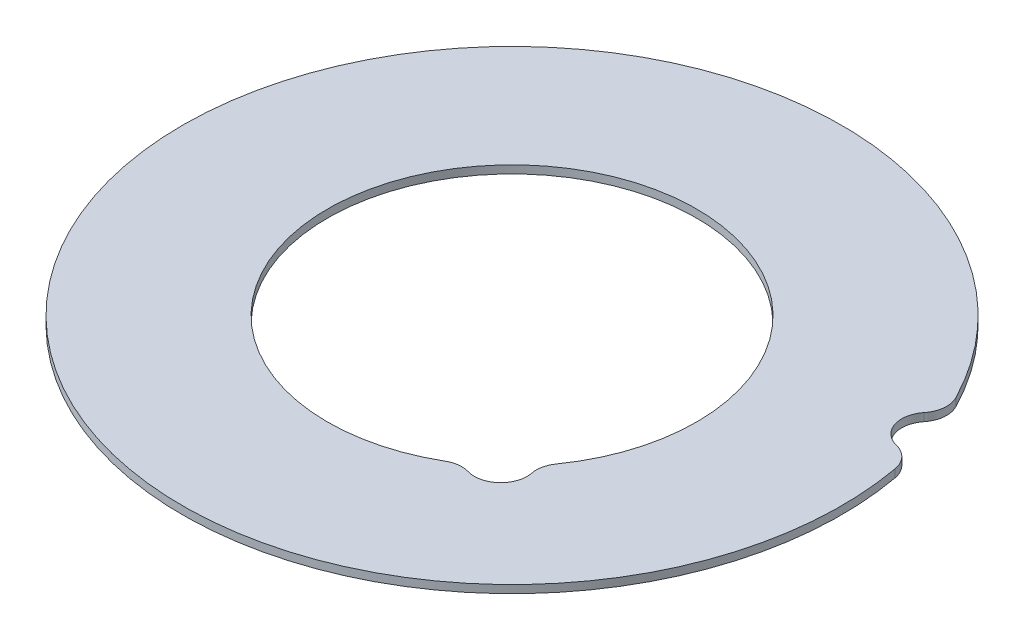
ISO-10303-21;
HEADER;
FILE_DESCRIPTION(('STEP AP214'),'2;1');
FILE_NAME('part.step','',(''),(''),'','','');
FILE_SCHEMA(('AUTOMOTIVE_DESIGN { 1 0 10303 214 1 1 1 1 }'));
ENDSEC;
DATA;
#1=APPLICATION_CONTEXT('core data for automotive mechanical design processes');
#2=APPLICATION_PROTOCOL_DEFINITION('international standard','automotive_design',2000,#1);
#3=PRODUCT_CONTEXT('',#1,'mechanical');
#4=PRODUCT('Part','Part','',(#3));
#5=PRODUCT_RELATED_PRODUCT_CATEGORY('part','',(#4));
#6=PRODUCT_DEFINITION_FORMATION('','',#4);
#7=PRODUCT_DEFINITION_CONTEXT('part definition',#1,'design');
#8=PRODUCT_DEFINITION('design','',#6,#7);
#9=PRODUCT_DEFINITION_SHAPE('','',#8);
#10=(LENGTH_UNIT() NAMED_UNIT(*) SI_UNIT(.MILLI.,.METRE.));
#11=(NAMED_UNIT(*) PLANE_ANGLE_UNIT() SI_UNIT($,.RADIAN.));
#12=(NAMED_UNIT(*) SI_UNIT($,.STERADIAN.) SOLID_ANGLE_UNIT());
#13=UNCERTAINTY_MEASURE_WITH_UNIT(LENGTH_MEASURE(1.E-05),#10,'distance_accuracy_value','');
#14=(GEOMETRIC_REPRESENTATION_CONTEXT(3) GLOBAL_UNCERTAINTY_ASSIGNED_CONTEXT((#13)) GLOBAL_UNIT_ASSIGNED_CONTEXT((#10,
#11,#12)) REPRESENTATION_CONTEXT('',''));
#15=CARTESIAN_POINT('',(0.,0.,0.));
#16=DIRECTION('',(0.,0.,1.));
#17=DIRECTION('',(1.,0.,0.));
#18=AXIS2_PLACEMENT_3D('',#15,#16,#17);
#19=CARTESIAN_POINT('',(-7.,0.,0.));
#20=DIRECTION('',(0.,1.,0.));
#21=DIRECTION('',(0.,0.,1.));
#22=AXIS2_PLACEMENT_3D('',#19,#20,#21);
#23=PLANE('',#22);
#24=CARTESIAN_POINT('',(4.5710736778126,0.,5.00000000005045));
#25=DIRECTION('',(0.,1.,0.));
#26=DIRECTION('',(0.,0.,1.));
#27=AXIS2_PLACEMENT_3D('',#24,#25,#26);
#28=CIRCLE('',#27,1.);
#29=CARTESIAN_POINT('',(4.29210611743141,0.,5.96030052606039));
#30=VERTEX_POINT('',#29);
#31=CARTESIAN_POINT('',(5.55247832229152,0.,4.80804968409548));
#32=VERTEX_POINT('',#31);
#33=EDGE_CURVE('E169',#30,#32,#28,.T.);
#34=ORIENTED_EDGE('',*,*,#33,.T.);
#35=CARTESIAN_POINT('',(6.53388296677043,0.,4.61609936814051));
#36=DIRECTION('',(0.,1.,0.));
#37=DIRECTION('',(0.,0.,1.));
#38=AXIS2_PLACEMENT_3D('',#35,#36,#37);
#39=CIRCLE('',#38,1.);
#40=CARTESIAN_POINT('',(5.71714759592413,0.,4.03908694712294));
#41=VERTEX_POINT('',#40);
#42=EDGE_CURVE('E144',#32,#41,#39,.F.);
#43=ORIENTED_EDGE('',*,*,#42,.T.);
#44=CARTESIAN_POINT('',(0.,0.,0.));
#45=DIRECTION('',(0.,-1.,0.));
#46=DIRECTION('',(0.,0.,-1.));
#47=AXIS2_PLACEMENT_3D('',#44,#45,#46);
#48=CIRCLE('',#47,7.);
#49=CARTESIAN_POINT('',(3.51149623741894,0.,6.05552592056154));
#50=VERTEX_POINT('',#49);
#51=EDGE_CURVE('E120',#50,#41,#48,.T.);
#52=ORIENTED_EDGE('',*,*,#51,.F.);
#53=CARTESIAN_POINT('',(4.01313855705022,0.,6.92060105207033));
#54=DIRECTION('',(0.,1.,0.));
#55=DIRECTION('',(0.,0.,1.));
#56=AXIS2_PLACEMENT_3D('',#53,#54,#55);
#57=CIRCLE('',#56,1.);
#58=EDGE_CURVE('E123',#50,#30,#57,.F.);
#59=ORIENTED_EDGE('',*,*,#58,.T.);
#60=EDGE_LOOP('',(#34,#43,#52,#59));
#61=FACE_BOUND('',#60,.T.);
#62=CARTESIAN_POINT('',(11.7827547059841,0.,-4.00000000062675));
#63=DIRECTION('',(0.,1.,0.));
#64=DIRECTION('',(0.,0.,1.));
#65=AXIS2_PLACEMENT_3D('',#62,#63,#64);
#66=CIRCLE('',#65,1.);
#67=CARTESIAN_POINT('',(11.0052387397314,0.,-4.62886319896337));
#68=VERTEX_POINT('',#67);
#69=CARTESIAN_POINT('',(11.5487809416498,0.,-3.02775708982552));
#70=VERTEX_POINT('',#69);
#71=EDGE_CURVE('E153',#68,#70,#66,.T.);
#72=ORIENTED_EDGE('',*,*,#71,.T.);
#73=CARTESIAN_POINT('',(11.3148071773155,0.,-2.0555141790243));
#74=DIRECTION('',(0.,1.,0.));
#75=DIRECTION('',(0.,0.,1.));
#76=AXIS2_PLACEMENT_3D('',#73,#74,#75);
#77=CIRCLE('',#76,1.);
#78=CARTESIAN_POINT('',(12.2987034536038,0.,-2.23425454241771));
#79=VERTEX_POINT('',#78);
#80=EDGE_CURVE('E141',#70,#79,#77,.F.);
#81=ORIENTED_EDGE('',*,*,#80,.T.);
#82=CARTESIAN_POINT('',(0.,0.,0.));
#83=DIRECTION('',(0.,-1.,0.));
#84=DIRECTION('',(0.,0.,-1.));
#85=AXIS2_PLACEMENT_3D('',#82,#83,#84);
#86=CIRCLE('',#85,12.5);
#87=CARTESIAN_POINT('',(11.1170899711725,0.,-5.7149199970652));
#88=VERTEX_POINT('',#87);
#89=EDGE_CURVE('E129',#79,#88,#86,.T.);
#90=ORIENTED_EDGE('',*,*,#89,.T.);
#91=CARTESIAN_POINT('',(10.2277227734787,0.,-5.25772639729998));
#92=DIRECTION('',(0.,1.,0.));
#93=DIRECTION('',(0.,0.,1.));
#94=AXIS2_PLACEMENT_3D('',#91,#92,#93);
#95=CIRCLE('',#94,1.);
#96=EDGE_CURVE('E53',#88,#68,#95,.F.);
#97=ORIENTED_EDGE('',*,*,#96,.T.);
#98=EDGE_LOOP('',(#72,#81,#90,#97));
#99=FACE_BOUND('',#98,.T.);
#100=ADVANCED_FACE('F33',(#61,#99),#23,.F.);
#101=CARTESIAN_POINT('',(0.,0.,0.));
#102=DIRECTION('',(0.,-1.,0.));
#103=DIRECTION('',(0.,0.,-1.));
#104=AXIS2_PLACEMENT_3D('',#101,#102,#103);
#105=CYLINDRICAL_SURFACE('',#104,12.5);
#106=ORIENTED_EDGE('',*,*,#89,.F.);
#107=DIRECTION('',(0.,-1.,0.));
#108=VECTOR('',#107,1.);
#109=CARTESIAN_POINT('',(12.2987034536038,0.,-2.23425454241771));
#110=LINE('',#109,#108);
#111=CARTESIAN_POINT('',(12.2987034536038,0.299999999999999,-2.23425454241771));
#112=VERTEX_POINT('',#111);
#113=EDGE_CURVE('E149',#79,#112,#110,.F.);
#114=ORIENTED_EDGE('',*,*,#113,.T.);
#115=CARTESIAN_POINT('',(0.,0.299999999999999,0.));
#116=DIRECTION('',(0.,-1.,0.));
#117=DIRECTION('',(0.,0.,-1.));
#118=AXIS2_PLACEMENT_3D('',#115,#116,#117);
#119=CIRCLE('',#118,12.5);
#120=CARTESIAN_POINT('',(11.1170899711725,0.299999999999999,-5.7149199970652));
#121=VERTEX_POINT('',#120);
#122=EDGE_CURVE('E119',#112,#121,#119,.T.);
#123=ORIENTED_EDGE('',*,*,#122,.T.);
#124=DIRECTION('',(0.,-1.,0.));
#125=VECTOR('',#124,1.);
#126=CARTESIAN_POINT('',(11.1170899711725,0.,-5.7149199970652));
#127=LINE('',#126,#125);
#128=EDGE_CURVE('E146',#121,#88,#127,.T.);
#129=ORIENTED_EDGE('',*,*,#128,.T.);
#130=EDGE_LOOP('',(#106,#114,#123,#129));
#131=FACE_BOUND('',#130,.T.);
#132=ADVANCED_FACE('F162',(#131),#105,.T.);
#133=CARTESIAN_POINT('',(-12.5,0.299999999999999,0.));
#134=DIRECTION('',(0.,-1.,0.));
#135=DIRECTION('',(0.,0.,-1.));
#136=AXIS2_PLACEMENT_3D('',#133,#134,#135);
#137=PLANE('',#136);
#138=ORIENTED_EDGE('',*,*,#122,.F.);
#139=CARTESIAN_POINT('',(11.3148071773155,0.3,-2.0555141790243));
#140=DIRECTION('',(0.,-1.,0.));
#141=DIRECTION('',(0.,0.,-1.));
#142=AXIS2_PLACEMENT_3D('',#139,#140,#141);
#143=CIRCLE('',#142,1.);
#144=CARTESIAN_POINT('',(11.5487809416498,0.3,-3.02775708982552));
#145=VERTEX_POINT('',#144);
#146=EDGE_CURVE('E108',#112,#145,#143,.F.);
#147=ORIENTED_EDGE('',*,*,#146,.T.);
#148=CARTESIAN_POINT('',(11.7827547059841,0.3,-4.00000000062675));
#149=DIRECTION('',(0.,-1.,0.));
#150=DIRECTION('',(0.,0.,-1.));
#151=AXIS2_PLACEMENT_3D('',#148,#149,#150);
#152=CIRCLE('',#151,1.);
#153=CARTESIAN_POINT('',(11.0052387397314,0.3,-4.62886319896337));
#154=VERTEX_POINT('',#153);
#155=EDGE_CURVE('E124',#145,#154,#152,.T.);
#156=ORIENTED_EDGE('',*,*,#155,.T.);
#157=CARTESIAN_POINT('',(10.2277227734787,0.3,-5.25772639729998));
#158=DIRECTION('',(0.,-1.,0.));
#159=DIRECTION('',(0.,0.,-1.));
#160=AXIS2_PLACEMENT_3D('',#157,#158,#159);
#161=CIRCLE('',#160,1.);
#162=EDGE_CURVE('E126',#154,#121,#161,.F.);
#163=ORIENTED_EDGE('',*,*,#162,.T.);
#164=EDGE_LOOP('',(#138,#147,#156,#163));
#165=FACE_BOUND('',#164,.T.);
#166=CARTESIAN_POINT('',(0.,0.299999999999999,0.));
#167=DIRECTION('',(0.,-1.,0.));
#168=DIRECTION('',(0.,0.,-1.));
#169=AXIS2_PLACEMENT_3D('',#166,#167,#168);
#170=CIRCLE('',#169,7.);
#171=CARTESIAN_POINT('',(3.51149623741894,0.299999999999999,6.05552592056154));
#172=VERTEX_POINT('',#171);
#173=CARTESIAN_POINT('',(5.71714759592413,0.299999999999999,4.03908694712294));
#174=VERTEX_POINT('',#173);
#175=EDGE_CURVE('E101',#172,#174,#170,.T.);
#176=ORIENTED_EDGE('',*,*,#175,.T.);
#177=CARTESIAN_POINT('',(6.53388296677043,0.3,4.61609936814051));
#178=DIRECTION('',(0.,-1.,0.));
#179=DIRECTION('',(0.,0.,-1.));
#180=AXIS2_PLACEMENT_3D('',#177,#178,#179);
#181=CIRCLE('',#180,1.);
#182=CARTESIAN_POINT('',(5.55247832229152,0.299999999999999,4.80804968409548));
#183=VERTEX_POINT('',#182);
#184=EDGE_CURVE('E107',#174,#183,#181,.F.);
#185=ORIENTED_EDGE('',*,*,#184,.T.);
#186=CARTESIAN_POINT('',(4.5710736778126,0.299999999999999,5.00000000005045));
#187=DIRECTION('',(0.,1.,0.));
#188=DIRECTION('',(0.,0.,1.));
#189=AXIS2_PLACEMENT_3D('',#186,#187,#188);
#190=CIRCLE('',#189,1.);
#191=CARTESIAN_POINT('',(4.29210611743141,0.299999999999999,5.96030052606039));
#192=VERTEX_POINT('',#191);
#193=EDGE_CURVE('E103',#192,#183,#190,.T.);
#194=ORIENTED_EDGE('',*,*,#193,.F.);
#195=CARTESIAN_POINT('',(4.01313855705022,0.3,6.92060105207033));
#196=DIRECTION('',(0.,-1.,0.));
#197=DIRECTION('',(0.,0.,-1.));
#198=AXIS2_PLACEMENT_3D('',#195,#196,#197);
#199=CIRCLE('',#198,1.);
#200=EDGE_CURVE('E98',#192,#172,#199,.F.);
#201=ORIENTED_EDGE('',*,*,#200,.T.);
#202=EDGE_LOOP('',(#176,#185,#194,#201));
#203=FACE_BOUND('',#202,.T.);
#204=ADVANCED_FACE('F100',(#165,#203),#137,.F.);
#205=CARTESIAN_POINT('',(0.,0.,0.));
#206=DIRECTION('',(0.,-1.,0.));
#207=DIRECTION('',(0.,0.,-1.));
#208=AXIS2_PLACEMENT_3D('',#205,#206,#207);
#209=CYLINDRICAL_SURFACE('',#208,7.);
#210=ORIENTED_EDGE('',*,*,#51,.T.);
#211=DIRECTION('',(0.,-1.,0.));
#212=VECTOR('',#211,1.);
#213=CARTESIAN_POINT('',(5.71714759592413,0.,4.03908694712294));
#214=LINE('',#213,#212);
#215=EDGE_CURVE('E118',#41,#174,#214,.F.);
#216=ORIENTED_EDGE('',*,*,#215,.T.);
#217=ORIENTED_EDGE('',*,*,#175,.F.);
#218=DIRECTION('',(0.,-1.,0.));
#219=VECTOR('',#218,1.);
#220=CARTESIAN_POINT('',(3.51149623741894,0.,6.05552592056154));
#221=LINE('',#220,#219);
#222=EDGE_CURVE('E115',#172,#50,#221,.T.);
#223=ORIENTED_EDGE('',*,*,#222,.T.);
#224=EDGE_LOOP('',(#210,#216,#217,#223));
#225=FACE_BOUND('',#224,.T.);
#226=ADVANCED_FACE('F114',(#225),#209,.F.);
#227=CARTESIAN_POINT('',(4.5710736778126,-9.7,5.00000000005045));
#228=DIRECTION('',(0.,1.,0.));
#229=DIRECTION('',(0.,0.,1.));
#230=AXIS2_PLACEMENT_3D('',#227,#228,#229);
#231=CYLINDRICAL_SURFACE('',#230,1.);
#232=ORIENTED_EDGE('',*,*,#193,.T.);
#233=DIRECTION('',(0.,1.,0.));
#234=VECTOR('',#233,1.);
#235=CARTESIAN_POINT('',(5.55247832229152,-9.7,4.80804968409548));
#236=LINE('',#235,#234);
#237=EDGE_CURVE('E138',#183,#32,#236,.F.);
#238=ORIENTED_EDGE('',*,*,#237,.T.);
#239=ORIENTED_EDGE('',*,*,#33,.F.);
#240=DIRECTION('',(0.,1.,0.));
#241=VECTOR('',#240,1.);
#242=CARTESIAN_POINT('',(4.29210611743141,-9.7,5.96030052606039));
#243=LINE('',#242,#241);
#244=EDGE_CURVE('E136',#30,#192,#243,.T.);
#245=ORIENTED_EDGE('',*,*,#244,.T.);
#246=EDGE_LOOP('',(#232,#238,#239,#245));
#247=FACE_BOUND('',#246,.T.);
#248=ADVANCED_FACE('F174',(#247),#231,.F.);
#249=CARTESIAN_POINT('',(11.7827547059841,-9.7,-4.00000000062675));
#250=DIRECTION('',(0.,1.,0.));
#251=DIRECTION('',(0.,0.,1.));
#252=AXIS2_PLACEMENT_3D('',#249,#250,#251);
#253=CYLINDRICAL_SURFACE('',#252,1.);
#254=ORIENTED_EDGE('',*,*,#155,.F.);
#255=DIRECTION('',(0.,1.,0.));
#256=VECTOR('',#255,1.);
#257=CARTESIAN_POINT('',(11.5487809416498,-9.7,-3.02775708982552));
#258=LINE('',#257,#256);
#259=EDGE_CURVE('E11',#145,#70,#258,.F.);
#260=ORIENTED_EDGE('',*,*,#259,.T.);
#261=ORIENTED_EDGE('',*,*,#71,.F.);
#262=DIRECTION('',(0.,1.,0.));
#263=VECTOR('',#262,1.);
#264=CARTESIAN_POINT('',(11.0052387397314,-9.7,-4.62886319896337));
#265=LINE('',#264,#263);
#266=EDGE_CURVE('E41',#68,#154,#265,.T.);
#267=ORIENTED_EDGE('',*,*,#266,.T.);
#268=EDGE_LOOP('',(#254,#260,#261,#267));
#269=FACE_BOUND('',#268,.T.);
#270=ADVANCED_FACE('F152',(#269),#253,.F.);
#271=CARTESIAN_POINT('',(6.53388296677043,-9.7,4.61609936814051));
#272=DIRECTION('',(0.,1.,0.));
#273=DIRECTION('',(0.,0.,1.));
#274=AXIS2_PLACEMENT_3D('',#271,#272,#273);
#275=CYLINDRICAL_SURFACE('',#274,1.);
#276=ORIENTED_EDGE('',*,*,#42,.F.);
#277=ORIENTED_EDGE('',*,*,#237,.F.);
#278=ORIENTED_EDGE('',*,*,#184,.F.);
#279=ORIENTED_EDGE('',*,*,#215,.F.);
#280=EDGE_LOOP('',(#276,#277,#278,#279));
#281=FACE_BOUND('',#280,.T.);
#282=ADVANCED_FACE('F178',(#281),#275,.T.);
#283=CARTESIAN_POINT('',(4.01313855705022,-9.7,6.92060105207033));
#284=DIRECTION('',(0.,-1.,0.));
#285=DIRECTION('',(0.,0.,-1.));
#286=AXIS2_PLACEMENT_3D('',#283,#284,#285);
#287=CYLINDRICAL_SURFACE('',#286,1.);
#288=ORIENTED_EDGE('',*,*,#200,.F.);
#289=ORIENTED_EDGE('',*,*,#244,.F.);
#290=ORIENTED_EDGE('',*,*,#58,.F.);
#291=ORIENTED_EDGE('',*,*,#222,.F.);
#292=EDGE_LOOP('',(#288,#289,#290,#291));
#293=FACE_BOUND('',#292,.T.);
#294=ADVANCED_FACE('F122',(#293),#287,.T.);
#295=CARTESIAN_POINT('',(11.3148071773155,-9.7,-2.0555141790243));
#296=DIRECTION('',(0.,-1.,0.));
#297=DIRECTION('',(0.,0.,-1.));
#298=AXIS2_PLACEMENT_3D('',#295,#296,#297);
#299=CYLINDRICAL_SURFACE('',#298,1.);
#300=ORIENTED_EDGE('',*,*,#80,.F.);
#301=ORIENTED_EDGE('',*,*,#259,.F.);
#302=ORIENTED_EDGE('',*,*,#146,.F.);
#303=ORIENTED_EDGE('',*,*,#113,.F.);
#304=EDGE_LOOP('',(#300,#301,#302,#303));
#305=FACE_BOUND('',#304,.T.);
#306=ADVANCED_FACE('F191',(#305),#299,.T.);
#307=CARTESIAN_POINT('',(10.2277227734787,-9.7,-5.25772639729998));
#308=DIRECTION('',(0.,1.,0.));
#309=DIRECTION('',(0.,0.,1.));
#310=AXIS2_PLACEMENT_3D('',#307,#308,#309);
#311=CYLINDRICAL_SURFACE('',#310,1.);
#312=ORIENTED_EDGE('',*,*,#162,.F.);
#313=ORIENTED_EDGE('',*,*,#266,.F.);
#314=ORIENTED_EDGE('',*,*,#96,.F.);
#315=ORIENTED_EDGE('',*,*,#128,.F.);
#316=EDGE_LOOP('',(#312,#313,#314,#315));
#317=FACE_BOUND('',#316,.T.);
#318=ADVANCED_FACE('F35',(#317),#311,.T.);
#319=CLOSED_SHELL('',(#100,#132,#204,#226,#248,#270,#282,#294,#306,#318));
#320=MANIFOLD_SOLID_BREP('B2',#319);
#321=ADVANCED_BREP_SHAPE_REPRESENTATION('',(#18,#320),#14);
#322=SHAPE_DEFINITION_REPRESENTATION(#9,#321);
ENDSEC;
END-ISO-10303-21;
